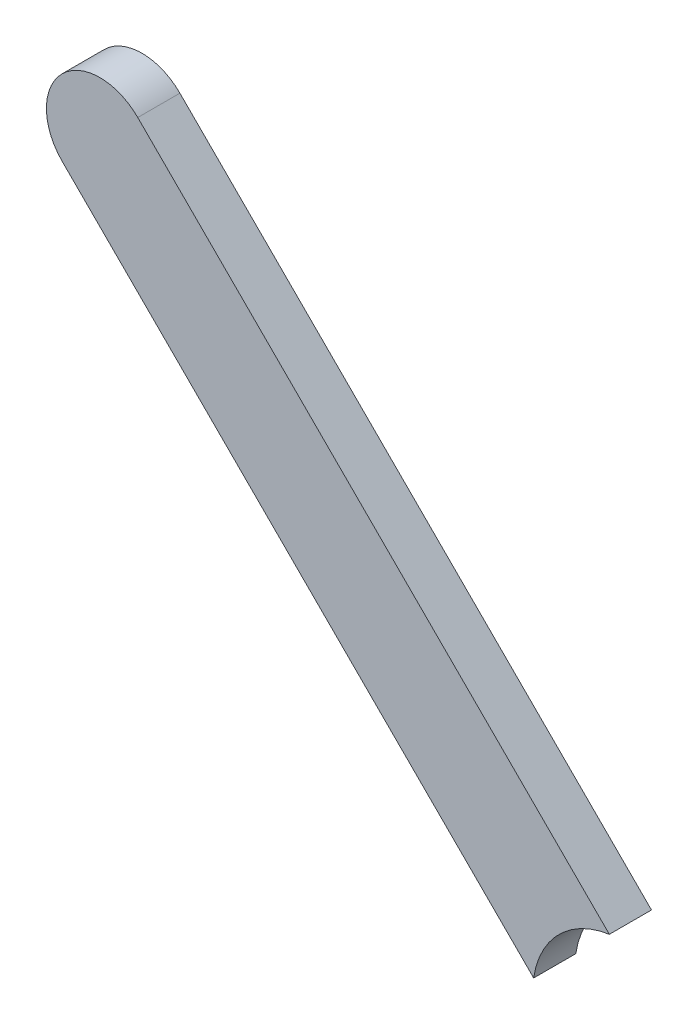
ISO-10303-21;
HEADER;
FILE_DESCRIPTION(('STEP AP214'),'2;1');
FILE_NAME('part.step','',(''),(''),'','','');
FILE_SCHEMA(('AUTOMOTIVE_DESIGN { 1 0 10303 214 1 1 1 1 }'));
ENDSEC;
DATA;
#1=APPLICATION_CONTEXT('core data for automotive mechanical design processes');
#2=APPLICATION_PROTOCOL_DEFINITION('international standard','automotive_design',2000,#1);
#3=PRODUCT_CONTEXT('',#1,'mechanical');
#4=PRODUCT('Part','Part','',(#3));
#5=PRODUCT_RELATED_PRODUCT_CATEGORY('part','',(#4));
#6=PRODUCT_DEFINITION_FORMATION('','',#4);
#7=PRODUCT_DEFINITION_CONTEXT('part definition',#1,'design');
#8=PRODUCT_DEFINITION('design','',#6,#7);
#9=PRODUCT_DEFINITION_SHAPE('','',#8);
#10=(LENGTH_UNIT() NAMED_UNIT(*) SI_UNIT(.MILLI.,.METRE.));
#11=(NAMED_UNIT(*) PLANE_ANGLE_UNIT() SI_UNIT($,.RADIAN.));
#12=(NAMED_UNIT(*) SI_UNIT($,.STERADIAN.) SOLID_ANGLE_UNIT());
#13=UNCERTAINTY_MEASURE_WITH_UNIT(LENGTH_MEASURE(1.E-05),#10,'distance_accuracy_value','');
#14=(GEOMETRIC_REPRESENTATION_CONTEXT(3) GLOBAL_UNCERTAINTY_ASSIGNED_CONTEXT((#13)) GLOBAL_UNIT_ASSIGNED_CONTEXT((#10,
#11,#12)) REPRESENTATION_CONTEXT('',''));
#15=CARTESIAN_POINT('',(0.,0.,0.));
#16=DIRECTION('',(0.,0.,1.));
#17=DIRECTION('',(1.,0.,0.));
#18=AXIS2_PLACEMENT_3D('',#15,#16,#17);
#19=CARTESIAN_POINT('',(104.90979526,110.69139406,0.));
#20=DIRECTION('',(0.707106781186545,0.70710678118655,0.));
#21=DIRECTION('',(0.70710678118655,-0.707106781186545,0.));
#22=AXIS2_PLACEMENT_3D('',#19,#20,#21);
#23=PLANE('',#22);
#24=DIRECTION('',(0.70710678118655,-0.707106781186545,0.));
#25=VECTOR('',#24,1.);
#26=CARTESIAN_POINT('',(104.90979526,110.69139406,0.1999996));
#27=LINE('',#26,#25);
#28=CARTESIAN_POINT('',(104.90979526,110.69139406,0.1999996));
#29=VERTEX_POINT('',#28);
#30=CARTESIAN_POINT('',(107.14844928455,108.45274003545,0.1999996));
#31=VERTEX_POINT('',#30);
#32=EDGE_CURVE('E11',#29,#31,#27,.T.);
#33=ORIENTED_EDGE('',*,*,#32,.F.);
#34=DIRECTION('',(0.,0.,1.));
#35=VECTOR('',#34,1.);
#36=CARTESIAN_POINT('',(104.90979526,110.69139406,0.));
#37=LINE('',#36,#35);
#38=CARTESIAN_POINT('',(104.90979526,110.69139406,0.));
#39=VERTEX_POINT('',#38);
#40=EDGE_CURVE('E24',#39,#29,#37,.T.);
#41=ORIENTED_EDGE('',*,*,#40,.F.);
#42=DIRECTION('',(0.70710678118655,-0.707106781186545,0.));
#43=VECTOR('',#42,1.);
#44=CARTESIAN_POINT('',(104.90979526,110.69139406,0.));
#45=LINE('',#44,#43);
#46=CARTESIAN_POINT('',(107.14844928455,108.45274003545,0.));
#47=VERTEX_POINT('',#46);
#48=EDGE_CURVE('E75',#39,#47,#45,.T.);
#49=ORIENTED_EDGE('',*,*,#48,.T.);
#50=DIRECTION('',(0.,0.,1.));
#51=VECTOR('',#50,1.);
#52=CARTESIAN_POINT('',(107.14844928455,108.45274003545,0.));
#53=LINE('',#52,#51);
#54=EDGE_CURVE('E37',#47,#31,#53,.T.);
#55=ORIENTED_EDGE('',*,*,#54,.T.);
#56=EDGE_LOOP('',(#33,#41,#49,#55));
#57=FACE_BOUND('',#56,.T.);
#58=ADVANCED_FACE('F17',(#57),#23,.F.);
#59=CARTESIAN_POINT('',(107.569,108.3914012,0.));
#60=DIRECTION('',(0.,0.,-1.));
#61=DIRECTION('',(1.,0.,0.));
#62=AXIS2_PLACEMENT_3D('',#59,#60,#61);
#63=CYLINDRICAL_SURFACE('',#62,0.42500042);
#64=DIRECTION('',(0.,0.,1.));
#65=VECTOR('',#64,1.);
#66=CARTESIAN_POINT('',(107.50766116455,108.81195191545,0.));
#67=LINE('',#66,#65);
#68=CARTESIAN_POINT('',(107.50766116455,108.81195191545,0.));
#69=VERTEX_POINT('',#68);
#70=CARTESIAN_POINT('',(107.50766116455,108.81195191545,0.1999996));
#71=VERTEX_POINT('',#70);
#72=EDGE_CURVE('E67',#69,#71,#67,.T.);
#73=ORIENTED_EDGE('',*,*,#72,.T.);
#74=CARTESIAN_POINT('',(107.569,108.3914012,0.1999996));
#75=DIRECTION('',(0.,0.,1.));
#76=DIRECTION('',(1.,0.,0.));
#77=AXIS2_PLACEMENT_3D('',#74,#75,#76);
#78=CIRCLE('',#77,0.42500042);
#79=EDGE_CURVE('E82',#71,#31,#78,.T.);
#80=ORIENTED_EDGE('',*,*,#79,.T.);
#81=ORIENTED_EDGE('',*,*,#54,.F.);
#82=CARTESIAN_POINT('',(107.569,108.3914012,0.));
#83=DIRECTION('',(0.,0.,1.));
#84=DIRECTION('',(1.,0.,0.));
#85=AXIS2_PLACEMENT_3D('',#82,#83,#84);
#86=CIRCLE('',#85,0.42500042);
#87=EDGE_CURVE('E80',#69,#47,#86,.T.);
#88=ORIENTED_EDGE('',*,*,#87,.F.);
#89=EDGE_LOOP('',(#73,#80,#81,#88));
#90=FACE_BOUND('',#89,.T.);
#91=ADVANCED_FACE('F88',(#90),#63,.F.);
#92=CARTESIAN_POINT('',(107.50766116455,108.81195191545,0.));
#93=DIRECTION('',(-0.707106781186548,-0.707106781186548,0.));
#94=DIRECTION('',(-0.707106781186548,0.707106781186548,0.));
#95=AXIS2_PLACEMENT_3D('',#92,#93,#94);
#96=PLANE('',#95);
#97=DIRECTION('',(-0.707106781186548,0.707106781186548,0.));
#98=VECTOR('',#97,1.);
#99=CARTESIAN_POINT('',(107.74860594,108.57100714,0.1999996));
#100=LINE('',#99,#98);
#101=CARTESIAN_POINT('',(105.26900714,111.05060594,0.1999996));
#102=VERTEX_POINT('',#101);
#103=EDGE_CURVE('E71',#71,#102,#100,.T.);
#104=ORIENTED_EDGE('',*,*,#103,.F.);
#105=ORIENTED_EDGE('',*,*,#72,.F.);
#106=DIRECTION('',(-0.707106781186548,0.707106781186548,0.));
#107=VECTOR('',#106,1.);
#108=CARTESIAN_POINT('',(107.74860594,108.57100714,0.));
#109=LINE('',#108,#107);
#110=CARTESIAN_POINT('',(105.26900714,111.05060594,0.));
#111=VERTEX_POINT('',#110);
#112=EDGE_CURVE('E63',#69,#111,#109,.T.);
#113=ORIENTED_EDGE('',*,*,#112,.T.);
#114=DIRECTION('',(0.,0.,1.));
#115=VECTOR('',#114,1.);
#116=CARTESIAN_POINT('',(105.26900714,111.05060594,0.));
#117=LINE('',#116,#115);
#118=EDGE_CURVE('E53',#111,#102,#117,.T.);
#119=ORIENTED_EDGE('',*,*,#118,.T.);
#120=EDGE_LOOP('',(#104,#105,#113,#119));
#121=FACE_BOUND('',#120,.T.);
#122=ADVANCED_FACE('F66',(#121),#96,.F.);
#123=CARTESIAN_POINT('',(105.0894012,110.871,0.));
#124=DIRECTION('',(0.,0.,-1.));
#125=DIRECTION('',(0.70710678118652,0.707106781186576,0.));
#126=AXIS2_PLACEMENT_3D('',#123,#124,#125);
#127=CYLINDRICAL_SURFACE('',#126,0.254001156230778);
#128=CARTESIAN_POINT('',(105.0894012,110.871,0.1999996));
#129=DIRECTION('',(0.,0.,1.));
#130=DIRECTION('',(0.70710678118652,0.707106781186576,0.));
#131=AXIS2_PLACEMENT_3D('',#128,#129,#130);
#132=CIRCLE('',#131,0.254001156230778);
#133=EDGE_CURVE('E59',#102,#29,#132,.T.);
#134=ORIENTED_EDGE('',*,*,#133,.F.);
#135=ORIENTED_EDGE('',*,*,#118,.F.);
#136=CARTESIAN_POINT('',(105.0894012,110.871,0.));
#137=DIRECTION('',(0.,0.,1.));
#138=DIRECTION('',(0.70710678118652,0.707106781186576,0.));
#139=AXIS2_PLACEMENT_3D('',#136,#137,#138);
#140=CIRCLE('',#139,0.254001156230778);
#141=EDGE_CURVE('E57',#111,#39,#140,.T.);
#142=ORIENTED_EDGE('',*,*,#141,.T.);
#143=ORIENTED_EDGE('',*,*,#40,.T.);
#144=EDGE_LOOP('',(#134,#135,#142,#143));
#145=FACE_BOUND('',#144,.T.);
#146=ADVANCED_FACE('F55',(#145),#127,.T.);
#147=CARTESIAN_POINT('',(104.90979526,110.69139406,0.));
#148=DIRECTION('',(0.,0.,-1.));
#149=DIRECTION('',(-1.,0.,0.));
#150=AXIS2_PLACEMENT_3D('',#147,#148,#149);
#151=PLANE('',#150);
#152=ORIENTED_EDGE('',*,*,#48,.F.);
#153=ORIENTED_EDGE('',*,*,#141,.F.);
#154=ORIENTED_EDGE('',*,*,#112,.F.);
#155=ORIENTED_EDGE('',*,*,#87,.T.);
#156=EDGE_LOOP('',(#152,#153,#154,#155));
#157=FACE_BOUND('',#156,.T.);
#158=ADVANCED_FACE('F74',(#157),#151,.T.);
#159=CARTESIAN_POINT('',(104.90979526,110.69139406,0.1999996));
#160=DIRECTION('',(0.,0.,-1.));
#161=DIRECTION('',(-1.,0.,0.));
#162=AXIS2_PLACEMENT_3D('',#159,#160,#161);
#163=PLANE('',#162);
#164=ORIENTED_EDGE('',*,*,#133,.T.);
#165=ORIENTED_EDGE('',*,*,#32,.T.);
#166=ORIENTED_EDGE('',*,*,#79,.F.);
#167=ORIENTED_EDGE('',*,*,#103,.T.);
#168=EDGE_LOOP('',(#164,#165,#166,#167));
#169=FACE_BOUND('',#168,.T.);
#170=ADVANCED_FACE('F91',(#169),#163,.F.);
#171=CLOSED_SHELL('',(#58,#91,#122,#146,#158,#170));
#172=MANIFOLD_SOLID_BREP('B1',#171);
#173=ADVANCED_BREP_SHAPE_REPRESENTATION('',(#18,#172),#14);
#174=SHAPE_DEFINITION_REPRESENTATION(#9,#173);
ENDSEC;
END-ISO-10303-21;
